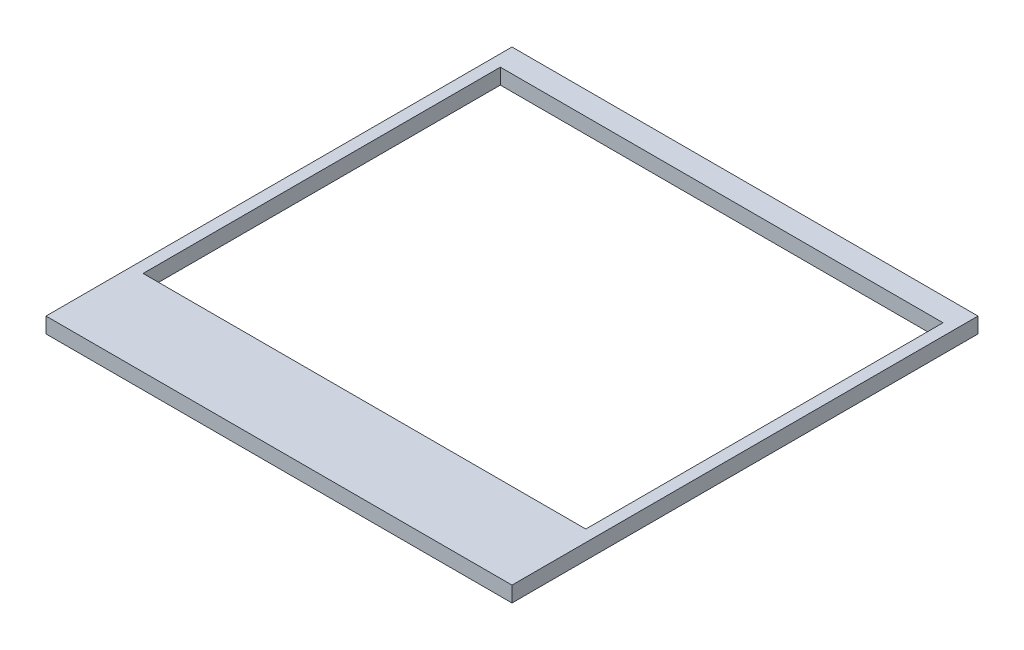
ISO-10303-21;
HEADER;
FILE_DESCRIPTION(('STEP AP214'),'2;1');
FILE_NAME('part.step','',(''),(''),'','','');
FILE_SCHEMA(('AUTOMOTIVE_DESIGN { 1 0 10303 214 1 1 1 1 }'));
ENDSEC;
DATA;
#1=APPLICATION_CONTEXT('core data for automotive mechanical design processes');
#2=APPLICATION_PROTOCOL_DEFINITION('international standard','automotive_design',2000,#1);
#3=PRODUCT_CONTEXT('',#1,'mechanical');
#4=PRODUCT('Part','Part','',(#3));
#5=PRODUCT_RELATED_PRODUCT_CATEGORY('part','',(#4));
#6=PRODUCT_DEFINITION_FORMATION('','',#4);
#7=PRODUCT_DEFINITION_CONTEXT('part definition',#1,'design');
#8=PRODUCT_DEFINITION('design','',#6,#7);
#9=PRODUCT_DEFINITION_SHAPE('','',#8);
#10=(LENGTH_UNIT() NAMED_UNIT(*) SI_UNIT(.MILLI.,.METRE.));
#11=(NAMED_UNIT(*) PLANE_ANGLE_UNIT() SI_UNIT($,.RADIAN.));
#12=(NAMED_UNIT(*) SI_UNIT($,.STERADIAN.) SOLID_ANGLE_UNIT());
#13=UNCERTAINTY_MEASURE_WITH_UNIT(LENGTH_MEASURE(1.E-05),#10,'distance_accuracy_value','');
#14=(GEOMETRIC_REPRESENTATION_CONTEXT(3) GLOBAL_UNCERTAINTY_ASSIGNED_CONTEXT((#13)) GLOBAL_UNIT_ASSIGNED_CONTEXT((#10,
#11,#12)) REPRESENTATION_CONTEXT('',''));
#15=CARTESIAN_POINT('',(0.,0.,0.));
#16=DIRECTION('',(0.,0.,1.));
#17=DIRECTION('',(1.,0.,0.));
#18=AXIS2_PLACEMENT_3D('',#15,#16,#17);
#19=CARTESIAN_POINT('',(38.1,2.54,38.1));
#20=DIRECTION('',(-1.,0.,0.));
#21=DIRECTION('',(0.,0.,1.));
#22=AXIS2_PLACEMENT_3D('',#19,#20,#21);
#23=PLANE('',#22);
#24=DIRECTION('',(0.,0.,-1.));
#25=VECTOR('',#24,1.);
#26=CARTESIAN_POINT('',(38.1,0.,38.1));
#27=LINE('',#26,#25);
#28=CARTESIAN_POINT('',(38.1,0.,38.1));
#29=VERTEX_POINT('',#28);
#30=CARTESIAN_POINT('',(38.1,0.,-38.1));
#31=VERTEX_POINT('',#30);
#32=EDGE_CURVE('E129',#29,#31,#27,.T.);
#33=ORIENTED_EDGE('',*,*,#32,.T.);
#34=DIRECTION('',(0.,-1.,0.));
#35=VECTOR('',#34,1.);
#36=CARTESIAN_POINT('',(38.1,2.54,-38.1));
#37=LINE('',#36,#35);
#38=CARTESIAN_POINT('',(38.1,2.54,-38.1));
#39=VERTEX_POINT('',#38);
#40=EDGE_CURVE('E11',#39,#31,#37,.T.);
#41=ORIENTED_EDGE('',*,*,#40,.F.);
#42=DIRECTION('',(0.,0.,-1.));
#43=VECTOR('',#42,1.);
#44=CARTESIAN_POINT('',(38.1,2.54,38.1));
#45=LINE('',#44,#43);
#46=CARTESIAN_POINT('',(38.1,2.54,38.1));
#47=VERTEX_POINT('',#46);
#48=EDGE_CURVE('E133',#47,#39,#45,.T.);
#49=ORIENTED_EDGE('',*,*,#48,.F.);
#50=DIRECTION('',(0.,-1.,0.));
#51=VECTOR('',#50,1.);
#52=CARTESIAN_POINT('',(38.1,2.54,38.1));
#53=LINE('',#52,#51);
#54=EDGE_CURVE('E143',#47,#29,#53,.T.);
#55=ORIENTED_EDGE('',*,*,#54,.T.);
#56=EDGE_LOOP('',(#33,#41,#49,#55));
#57=FACE_BOUND('',#56,.T.);
#58=ADVANCED_FACE('F32',(#57),#23,.F.);
#59=CARTESIAN_POINT('',(-38.1,2.54,-38.1));
#60=DIRECTION('',(0.,0.,1.));
#61=DIRECTION('',(1.,0.,0.));
#62=AXIS2_PLACEMENT_3D('',#59,#60,#61);
#63=PLANE('',#62);
#64=DIRECTION('',(-1.,0.,0.));
#65=VECTOR('',#64,1.);
#66=CARTESIAN_POINT('',(-38.1,0.,-38.1));
#67=LINE('',#66,#65);
#68=CARTESIAN_POINT('',(-38.1,0.,-38.1));
#69=VERTEX_POINT('',#68);
#70=EDGE_CURVE('E146',#31,#69,#67,.T.);
#71=ORIENTED_EDGE('',*,*,#70,.T.);
#72=DIRECTION('',(0.,-1.,0.));
#73=VECTOR('',#72,1.);
#74=CARTESIAN_POINT('',(-38.1,2.54,-38.1));
#75=LINE('',#74,#73);
#76=CARTESIAN_POINT('',(-38.1,2.54,-38.1));
#77=VERTEX_POINT('',#76);
#78=EDGE_CURVE('E39',#77,#69,#75,.T.);
#79=ORIENTED_EDGE('',*,*,#78,.F.);
#80=DIRECTION('',(-1.,0.,0.));
#81=VECTOR('',#80,1.);
#82=CARTESIAN_POINT('',(-38.1,2.54,-38.1));
#83=LINE('',#82,#81);
#84=EDGE_CURVE('E136',#39,#77,#83,.T.);
#85=ORIENTED_EDGE('',*,*,#84,.F.);
#86=ORIENTED_EDGE('',*,*,#40,.T.);
#87=EDGE_LOOP('',(#71,#79,#85,#86));
#88=FACE_BOUND('',#87,.T.);
#89=ADVANCED_FACE('F174',(#88),#63,.F.);
#90=CARTESIAN_POINT('',(-38.1,2.54,38.1));
#91=DIRECTION('',(1.,0.,0.));
#92=DIRECTION('',(0.,0.,-1.));
#93=AXIS2_PLACEMENT_3D('',#90,#91,#92);
#94=PLANE('',#93);
#95=DIRECTION('',(0.,0.,1.));
#96=VECTOR('',#95,1.);
#97=CARTESIAN_POINT('',(-38.1,0.,38.1));
#98=LINE('',#97,#96);
#99=CARTESIAN_POINT('',(-38.1,0.,38.1));
#100=VERTEX_POINT('',#99);
#101=EDGE_CURVE('E148',#69,#100,#98,.T.);
#102=ORIENTED_EDGE('',*,*,#101,.T.);
#103=DIRECTION('',(0.,-1.,0.));
#104=VECTOR('',#103,1.);
#105=CARTESIAN_POINT('',(-38.1,2.54,38.1));
#106=LINE('',#105,#104);
#107=CARTESIAN_POINT('',(-38.1,2.54,38.1));
#108=VERTEX_POINT('',#107);
#109=EDGE_CURVE('E153',#108,#100,#106,.T.);
#110=ORIENTED_EDGE('',*,*,#109,.F.);
#111=DIRECTION('',(0.,0.,1.));
#112=VECTOR('',#111,1.);
#113=CARTESIAN_POINT('',(-38.1,2.54,38.1));
#114=LINE('',#113,#112);
#115=EDGE_CURVE('E139',#77,#108,#114,.T.);
#116=ORIENTED_EDGE('',*,*,#115,.F.);
#117=ORIENTED_EDGE('',*,*,#78,.T.);
#118=EDGE_LOOP('',(#102,#110,#116,#117));
#119=FACE_BOUND('',#118,.T.);
#120=ADVANCED_FACE('F160',(#119),#94,.F.);
#121=CARTESIAN_POINT('',(-38.1,2.54,38.1));
#122=DIRECTION('',(0.,0.,-1.));
#123=DIRECTION('',(-1.,0.,0.));
#124=AXIS2_PLACEMENT_3D('',#121,#122,#123);
#125=PLANE('',#124);
#126=DIRECTION('',(1.,0.,0.));
#127=VECTOR('',#126,1.);
#128=CARTESIAN_POINT('',(-38.1,0.,38.1));
#129=LINE('',#128,#127);
#130=EDGE_CURVE('E137',#100,#29,#129,.T.);
#131=ORIENTED_EDGE('',*,*,#130,.T.);
#132=ORIENTED_EDGE('',*,*,#54,.F.);
#133=DIRECTION('',(1.,0.,0.));
#134=VECTOR('',#133,1.);
#135=CARTESIAN_POINT('',(-38.1,2.54,38.1));
#136=LINE('',#135,#134);
#137=EDGE_CURVE('E141',#108,#47,#136,.T.);
#138=ORIENTED_EDGE('',*,*,#137,.F.);
#139=ORIENTED_EDGE('',*,*,#109,.T.);
#140=EDGE_LOOP('',(#131,#132,#138,#139));
#141=FACE_BOUND('',#140,.T.);
#142=ADVANCED_FACE('F167',(#141),#125,.F.);
#143=CARTESIAN_POINT('',(0.,2.54,0.));
#144=DIRECTION('',(0.,-1.,0.));
#145=DIRECTION('',(0.,0.,-1.));
#146=AXIS2_PLACEMENT_3D('',#143,#144,#145);
#147=PLANE('',#146);
#148=DIRECTION('',(-1.,0.,0.));
#149=VECTOR('',#148,1.);
#150=CARTESIAN_POINT('',(-36.195,2.54,-34.29));
#151=LINE('',#150,#149);
#152=CARTESIAN_POINT('',(36.195,2.54,-34.29));
#153=VERTEX_POINT('',#152);
#154=CARTESIAN_POINT('',(-36.195,2.54,-34.29));
#155=VERTEX_POINT('',#154);
#156=EDGE_CURVE('E123',#153,#155,#151,.T.);
#157=ORIENTED_EDGE('',*,*,#156,.F.);
#158=DIRECTION('',(0.,0.,-1.));
#159=VECTOR('',#158,1.);
#160=CARTESIAN_POINT('',(36.195,2.54,24.13));
#161=LINE('',#160,#159);
#162=CARTESIAN_POINT('',(36.195,2.54,24.13));
#163=VERTEX_POINT('',#162);
#164=EDGE_CURVE('E46',#163,#153,#161,.T.);
#165=ORIENTED_EDGE('',*,*,#164,.F.);
#166=DIRECTION('',(1.,0.,0.));
#167=VECTOR('',#166,1.);
#168=CARTESIAN_POINT('',(-36.195,2.54,24.13));
#169=LINE('',#168,#167);
#170=CARTESIAN_POINT('',(-36.195,2.54,24.13));
#171=VERTEX_POINT('',#170);
#172=EDGE_CURVE('E114',#171,#163,#169,.T.);
#173=ORIENTED_EDGE('',*,*,#172,.F.);
#174=DIRECTION('',(0.,0.,1.));
#175=VECTOR('',#174,1.);
#176=CARTESIAN_POINT('',(-36.195,2.54,24.13));
#177=LINE('',#176,#175);
#178=EDGE_CURVE('E117',#155,#171,#177,.T.);
#179=ORIENTED_EDGE('',*,*,#178,.F.);
#180=EDGE_LOOP('',(#157,#165,#173,#179));
#181=FACE_BOUND('',#180,.T.);
#182=ORIENTED_EDGE('',*,*,#48,.T.);
#183=ORIENTED_EDGE('',*,*,#84,.T.);
#184=ORIENTED_EDGE('',*,*,#115,.T.);
#185=ORIENTED_EDGE('',*,*,#137,.T.);
#186=EDGE_LOOP('',(#182,#183,#184,#185));
#187=FACE_BOUND('',#186,.T.);
#188=ADVANCED_FACE('F173',(#181,#187),#147,.F.);
#189=CARTESIAN_POINT('',(0.,0.,0.));
#190=DIRECTION('',(0.,-1.,0.));
#191=DIRECTION('',(0.,0.,-1.));
#192=AXIS2_PLACEMENT_3D('',#189,#190,#191);
#193=PLANE('',#192);
#194=DIRECTION('',(0.,0.,-1.));
#195=VECTOR('',#194,1.);
#196=CARTESIAN_POINT('',(36.195,0.,24.13));
#197=LINE('',#196,#195);
#198=CARTESIAN_POINT('',(36.195,0.,24.13));
#199=VERTEX_POINT('',#198);
#200=CARTESIAN_POINT('',(36.195,0.,-34.29));
#201=VERTEX_POINT('',#200);
#202=EDGE_CURVE('E98',#199,#201,#197,.T.);
#203=ORIENTED_EDGE('',*,*,#202,.T.);
#204=DIRECTION('',(-1.,0.,0.));
#205=VECTOR('',#204,1.);
#206=CARTESIAN_POINT('',(-36.195,0.,-34.29));
#207=LINE('',#206,#205);
#208=CARTESIAN_POINT('',(-36.195,0.,-34.29));
#209=VERTEX_POINT('',#208);
#210=EDGE_CURVE('E107',#201,#209,#207,.T.);
#211=ORIENTED_EDGE('',*,*,#210,.T.);
#212=DIRECTION('',(0.,0.,1.));
#213=VECTOR('',#212,1.);
#214=CARTESIAN_POINT('',(-36.195,0.,24.13));
#215=LINE('',#214,#213);
#216=CARTESIAN_POINT('',(-36.195,0.,24.13));
#217=VERTEX_POINT('',#216);
#218=EDGE_CURVE('E54',#209,#217,#215,.T.);
#219=ORIENTED_EDGE('',*,*,#218,.T.);
#220=DIRECTION('',(1.,0.,0.));
#221=VECTOR('',#220,1.);
#222=CARTESIAN_POINT('',(-36.195,0.,24.13));
#223=LINE('',#222,#221);
#224=EDGE_CURVE('E104',#217,#199,#223,.T.);
#225=ORIENTED_EDGE('',*,*,#224,.T.);
#226=EDGE_LOOP('',(#203,#211,#219,#225));
#227=FACE_BOUND('',#226,.T.);
#228=ORIENTED_EDGE('',*,*,#32,.F.);
#229=ORIENTED_EDGE('',*,*,#130,.F.);
#230=ORIENTED_EDGE('',*,*,#101,.F.);
#231=ORIENTED_EDGE('',*,*,#70,.F.);
#232=EDGE_LOOP('',(#228,#229,#230,#231));
#233=FACE_BOUND('',#232,.T.);
#234=ADVANCED_FACE('F111',(#227,#233),#193,.T.);
#235=CARTESIAN_POINT('',(36.195,0.,24.13));
#236=DIRECTION('',(1.,0.,0.));
#237=DIRECTION('',(0.,0.,-1.));
#238=AXIS2_PLACEMENT_3D('',#235,#236,#237);
#239=PLANE('',#238);
#240=ORIENTED_EDGE('',*,*,#164,.T.);
#241=DIRECTION('',(0.,1.,0.));
#242=VECTOR('',#241,1.);
#243=CARTESIAN_POINT('',(36.195,0.,-34.29));
#244=LINE('',#243,#242);
#245=EDGE_CURVE('E94',#201,#153,#244,.T.);
#246=ORIENTED_EDGE('',*,*,#245,.F.);
#247=ORIENTED_EDGE('',*,*,#202,.F.);
#248=DIRECTION('',(0.,1.,0.));
#249=VECTOR('',#248,1.);
#250=CARTESIAN_POINT('',(36.195,0.,24.13));
#251=LINE('',#250,#249);
#252=EDGE_CURVE('E127',#199,#163,#251,.T.);
#253=ORIENTED_EDGE('',*,*,#252,.T.);
#254=EDGE_LOOP('',(#240,#246,#247,#253));
#255=FACE_BOUND('',#254,.T.);
#256=ADVANCED_FACE('F96',(#255),#239,.F.);
#257=CARTESIAN_POINT('',(-36.195,0.,24.13));
#258=DIRECTION('',(0.,0.,1.));
#259=DIRECTION('',(1.,0.,0.));
#260=AXIS2_PLACEMENT_3D('',#257,#258,#259);
#261=PLANE('',#260);
#262=ORIENTED_EDGE('',*,*,#172,.T.);
#263=ORIENTED_EDGE('',*,*,#252,.F.);
#264=ORIENTED_EDGE('',*,*,#224,.F.);
#265=DIRECTION('',(0.,1.,0.));
#266=VECTOR('',#265,1.);
#267=CARTESIAN_POINT('',(-36.195,0.,24.13));
#268=LINE('',#267,#266);
#269=EDGE_CURVE('E130',#217,#171,#268,.T.);
#270=ORIENTED_EDGE('',*,*,#269,.T.);
#271=EDGE_LOOP('',(#262,#263,#264,#270));
#272=FACE_BOUND('',#271,.T.);
#273=ADVANCED_FACE('F191',(#272),#261,.F.);
#274=CARTESIAN_POINT('',(-36.195,0.,24.13));
#275=DIRECTION('',(-1.,0.,0.));
#276=DIRECTION('',(0.,0.,1.));
#277=AXIS2_PLACEMENT_3D('',#274,#275,#276);
#278=PLANE('',#277);
#279=ORIENTED_EDGE('',*,*,#178,.T.);
#280=ORIENTED_EDGE('',*,*,#269,.F.);
#281=ORIENTED_EDGE('',*,*,#218,.F.);
#282=DIRECTION('',(0.,1.,0.));
#283=VECTOR('',#282,1.);
#284=CARTESIAN_POINT('',(-36.195,0.,-34.29));
#285=LINE('',#284,#283);
#286=EDGE_CURVE('E103',#209,#155,#285,.T.);
#287=ORIENTED_EDGE('',*,*,#286,.T.);
#288=EDGE_LOOP('',(#279,#280,#281,#287));
#289=FACE_BOUND('',#288,.T.);
#290=ADVANCED_FACE('F194',(#289),#278,.F.);
#291=CARTESIAN_POINT('',(-36.195,0.,-34.29));
#292=DIRECTION('',(0.,0.,-1.));
#293=DIRECTION('',(-1.,0.,0.));
#294=AXIS2_PLACEMENT_3D('',#291,#292,#293);
#295=PLANE('',#294);
#296=ORIENTED_EDGE('',*,*,#156,.T.);
#297=ORIENTED_EDGE('',*,*,#286,.F.);
#298=ORIENTED_EDGE('',*,*,#210,.F.);
#299=ORIENTED_EDGE('',*,*,#245,.T.);
#300=EDGE_LOOP('',(#296,#297,#298,#299));
#301=FACE_BOUND('',#300,.T.);
#302=ADVANCED_FACE('F108',(#301),#295,.F.);
#303=CLOSED_SHELL('',(#58,#89,#120,#142,#188,#234,#256,#273,#290,#302));
#304=MANIFOLD_SOLID_BREP('B2',#303);
#305=ADVANCED_BREP_SHAPE_REPRESENTATION('',(#18,#304),#14);
#306=SHAPE_DEFINITION_REPRESENTATION(#9,#305);
ENDSEC;
END-ISO-10303-21;
